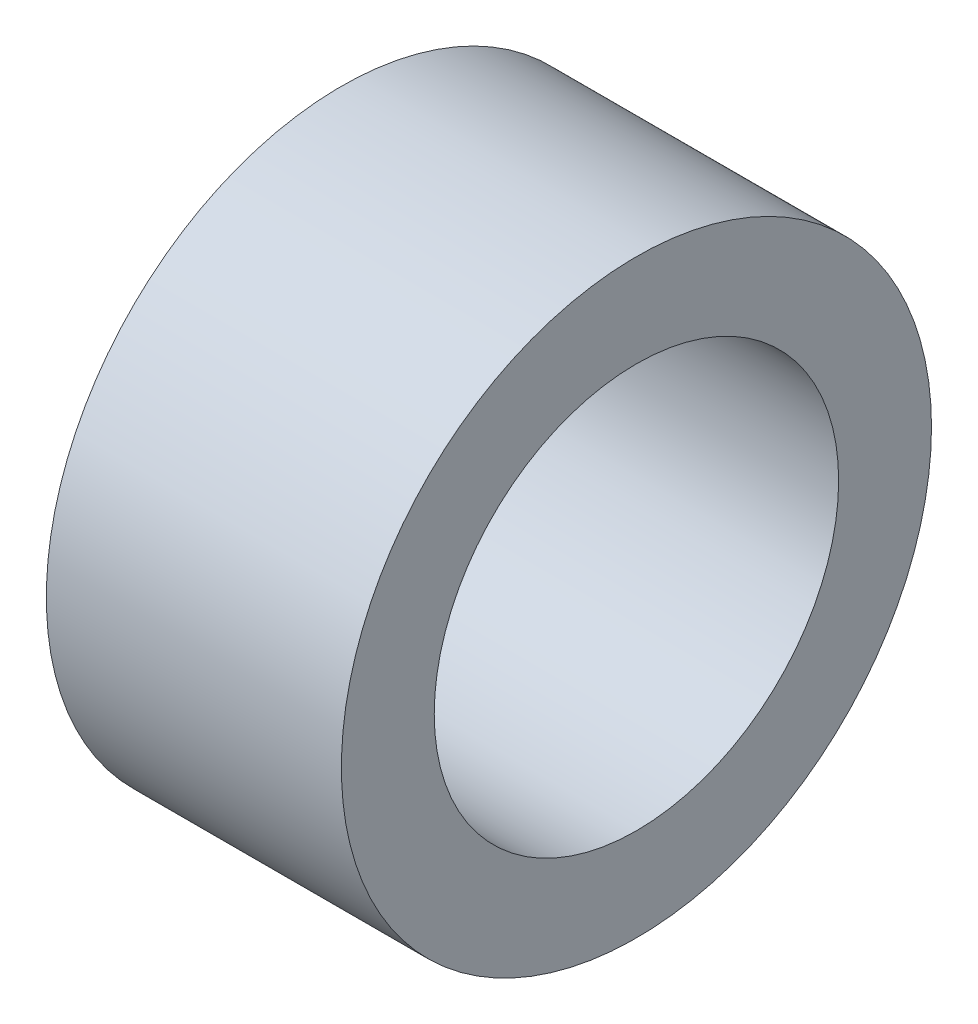
ISO-10303-21;
HEADER;
FILE_DESCRIPTION(('STEP AP214'),'2;1');
FILE_NAME('part.step','',(''),(''),'','','');
FILE_SCHEMA(('AUTOMOTIVE_DESIGN { 1 0 10303 214 1 1 1 1 }'));
ENDSEC;
DATA;
#1=APPLICATION_CONTEXT('core data for automotive mechanical design processes');
#2=APPLICATION_PROTOCOL_DEFINITION('international standard','automotive_design',2000,#1);
#3=PRODUCT_CONTEXT('',#1,'mechanical');
#4=PRODUCT('Part','Part','',(#3));
#5=PRODUCT_RELATED_PRODUCT_CATEGORY('part','',(#4));
#6=PRODUCT_DEFINITION_FORMATION('','',#4);
#7=PRODUCT_DEFINITION_CONTEXT('part definition',#1,'design');
#8=PRODUCT_DEFINITION('design','',#6,#7);
#9=PRODUCT_DEFINITION_SHAPE('','',#8);
#10=(LENGTH_UNIT() NAMED_UNIT(*) SI_UNIT(.MILLI.,.METRE.));
#11=(NAMED_UNIT(*) PLANE_ANGLE_UNIT() SI_UNIT($,.RADIAN.));
#12=(NAMED_UNIT(*) SI_UNIT($,.STERADIAN.) SOLID_ANGLE_UNIT());
#13=UNCERTAINTY_MEASURE_WITH_UNIT(LENGTH_MEASURE(1.E-05),#10,'distance_accuracy_value','');
#14=(GEOMETRIC_REPRESENTATION_CONTEXT(3) GLOBAL_UNCERTAINTY_ASSIGNED_CONTEXT((#13)) GLOBAL_UNIT_ASSIGNED_CONTEXT((#10,
#11,#12)) REPRESENTATION_CONTEXT('',''));
#15=CARTESIAN_POINT('',(0.,0.,0.));
#16=DIRECTION('',(0.,0.,1.));
#17=DIRECTION('',(1.,0.,0.));
#18=AXIS2_PLACEMENT_3D('',#15,#16,#17);
#19=CARTESIAN_POINT('',(0.,0.,0.));
#20=DIRECTION('',(1.,0.,0.));
#21=DIRECTION('',(0.,0.,-1.));
#22=AXIS2_PLACEMENT_3D('',#19,#20,#21);
#23=CYLINDRICAL_SURFACE('',#22,3.2639);
#24=CARTESIAN_POINT('',(4.7625,0.,0.));
#25=DIRECTION('',(1.,0.,0.));
#26=DIRECTION('',(0.,0.,-1.));
#27=AXIS2_PLACEMENT_3D('',#24,#25,#26);
#28=CIRCLE('',#27,3.2639);
#29=CARTESIAN_POINT('',(4.7625,0.,-3.2639));
#30=VERTEX_POINT('',#29);
#31=EDGE_CURVE('E17',#30,#30,#28,.F.);
#32=ORIENTED_EDGE('',*,*,#31,.F.);
#33=EDGE_LOOP('',(#32));
#34=FACE_BOUND('',#33,.T.);
#35=CARTESIAN_POINT('',(0.,0.,0.));
#36=DIRECTION('',(1.,0.,0.));
#37=DIRECTION('',(0.,0.,-1.));
#38=AXIS2_PLACEMENT_3D('',#35,#36,#37);
#39=CIRCLE('',#38,3.2639);
#40=CARTESIAN_POINT('',(0.,0.,-3.2639));
#41=VERTEX_POINT('',#40);
#42=EDGE_CURVE('E26',#41,#41,#39,.F.);
#43=ORIENTED_EDGE('',*,*,#42,.T.);
#44=EDGE_LOOP('',(#43));
#45=FACE_BOUND('',#44,.T.);
#46=ADVANCED_FACE('F14',(#34,#45),#23,.F.);
#47=CARTESIAN_POINT('',(4.7625,0.,0.));
#48=DIRECTION('',(1.,0.,0.));
#49=DIRECTION('',(0.,0.,-1.));
#50=AXIS2_PLACEMENT_3D('',#47,#48,#49);
#51=PLANE('',#50);
#52=ORIENTED_EDGE('',*,*,#31,.T.);
#53=EDGE_LOOP('',(#52));
#54=FACE_BOUND('',#53,.T.);
#55=CARTESIAN_POINT('',(4.7625,0.,0.));
#56=DIRECTION('',(1.,0.,0.));
#57=DIRECTION('',(0.,0.,-1.));
#58=AXIS2_PLACEMENT_3D('',#55,#56,#57);
#59=CIRCLE('',#58,4.7625);
#60=CARTESIAN_POINT('',(4.7625,0.,-4.7625));
#61=VERTEX_POINT('',#60);
#62=EDGE_CURVE('E21',#61,#61,#59,.F.);
#63=ORIENTED_EDGE('',*,*,#62,.F.);
#64=EDGE_LOOP('',(#63));
#65=FACE_BOUND('',#64,.T.);
#66=ADVANCED_FACE('F34',(#54,#65),#51,.T.);
#67=CARTESIAN_POINT('',(0.,0.,0.));
#68=DIRECTION('',(1.,0.,0.));
#69=DIRECTION('',(0.,0.,-1.));
#70=AXIS2_PLACEMENT_3D('',#67,#68,#69);
#71=PLANE('',#70);
#72=ORIENTED_EDGE('',*,*,#42,.F.);
#73=EDGE_LOOP('',(#72));
#74=FACE_BOUND('',#73,.T.);
#75=CARTESIAN_POINT('',(0.,0.,0.));
#76=DIRECTION('',(1.,0.,0.));
#77=DIRECTION('',(0.,0.,-1.));
#78=AXIS2_PLACEMENT_3D('',#75,#76,#77);
#79=CIRCLE('',#78,4.7625);
#80=CARTESIAN_POINT('',(0.,0.,-4.7625));
#81=VERTEX_POINT('',#80);
#82=EDGE_CURVE('E10',#81,#81,#79,.T.);
#83=ORIENTED_EDGE('',*,*,#82,.F.);
#84=EDGE_LOOP('',(#83));
#85=FACE_BOUND('',#84,.T.);
#86=ADVANCED_FACE('F42',(#74,#85),#71,.F.);
#87=CARTESIAN_POINT('',(0.,0.,0.));
#88=DIRECTION('',(1.,0.,0.));
#89=DIRECTION('',(0.,0.,-1.));
#90=AXIS2_PLACEMENT_3D('',#87,#88,#89);
#91=CYLINDRICAL_SURFACE('',#90,4.7625);
#92=ORIENTED_EDGE('',*,*,#62,.T.);
#93=EDGE_LOOP('',(#92));
#94=FACE_BOUND('',#93,.T.);
#95=ORIENTED_EDGE('',*,*,#82,.T.);
#96=EDGE_LOOP('',(#95));
#97=FACE_BOUND('',#96,.T.);
#98=ADVANCED_FACE('F43',(#94,#97),#91,.T.);
#99=CLOSED_SHELL('',(#46,#66,#86,#98));
#100=MANIFOLD_SOLID_BREP('B1',#99);
#101=ADVANCED_BREP_SHAPE_REPRESENTATION('',(#18,#100),#14);
#102=SHAPE_DEFINITION_REPRESENTATION(#9,#101);
ENDSEC;
END-ISO-10303-21;
